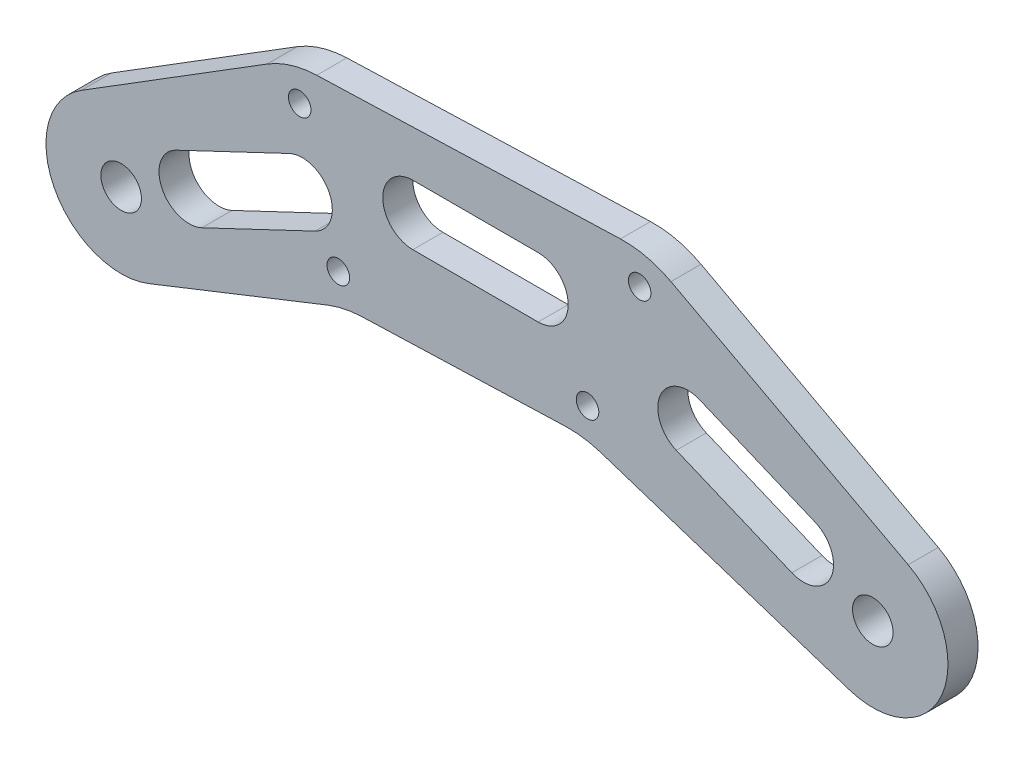
ISO-10303-21;
HEADER;
FILE_DESCRIPTION(('STEP AP214'),'2;1');
FILE_NAME('part.step','',(''),(''),'','','');
FILE_SCHEMA(('AUTOMOTIVE_DESIGN { 1 0 10303 214 1 1 1 1 }'));
ENDSEC;
DATA;
#1=APPLICATION_CONTEXT('core data for automotive mechanical design processes');
#2=APPLICATION_PROTOCOL_DEFINITION('international standard','automotive_design',2000,#1);
#3=PRODUCT_CONTEXT('',#1,'mechanical');
#4=PRODUCT('Part','Part','',(#3));
#5=PRODUCT_RELATED_PRODUCT_CATEGORY('part','',(#4));
#6=PRODUCT_DEFINITION_FORMATION('','',#4);
#7=PRODUCT_DEFINITION_CONTEXT('part definition',#1,'design');
#8=PRODUCT_DEFINITION('design','',#6,#7);
#9=PRODUCT_DEFINITION_SHAPE('','',#8);
#10=(LENGTH_UNIT() NAMED_UNIT(*) SI_UNIT(.MILLI.,.METRE.));
#11=(NAMED_UNIT(*) PLANE_ANGLE_UNIT() SI_UNIT($,.RADIAN.));
#12=(NAMED_UNIT(*) SI_UNIT($,.STERADIAN.) SOLID_ANGLE_UNIT());
#13=UNCERTAINTY_MEASURE_WITH_UNIT(LENGTH_MEASURE(1.E-05),#10,'distance_accuracy_value','');
#14=(GEOMETRIC_REPRESENTATION_CONTEXT(3) GLOBAL_UNCERTAINTY_ASSIGNED_CONTEXT((#13)) GLOBAL_UNIT_ASSIGNED_CONTEXT((#10,
#11,#12)) REPRESENTATION_CONTEXT('',''));
#15=CARTESIAN_POINT('',(0.,0.,0.));
#16=DIRECTION('',(0.,0.,1.));
#17=DIRECTION('',(1.,0.,0.));
#18=AXIS2_PLACEMENT_3D('',#15,#16,#17);
#19=CARTESIAN_POINT('',(-70.7115512272148,-24.2665577541173,6.));
#20=DIRECTION('',(0.,0.,-1.));
#21=DIRECTION('',(-1.,0.,0.));
#22=AXIS2_PLACEMENT_3D('',#19,#20,#21);
#23=PLANE('',#22);
#24=DIRECTION('',(1.,0.,0.));
#25=VECTOR('',#24,1.);
#26=CARTESIAN_POINT('',(-12.5,-6.,6.));
#27=LINE('',#26,#25);
#28=CARTESIAN_POINT('',(-12.5,-6.,6.));
#29=VERTEX_POINT('',#28);
#30=CARTESIAN_POINT('',(12.5,-6.,6.));
#31=VERTEX_POINT('',#30);
#32=EDGE_CURVE('E223',#29,#31,#27,.T.);
#33=ORIENTED_EDGE('',*,*,#32,.F.);
#34=CARTESIAN_POINT('',(-12.5,0.,6.));
#35=DIRECTION('',(0.,0.,1.));
#36=DIRECTION('',(1.,0.,0.));
#37=AXIS2_PLACEMENT_3D('',#34,#35,#36);
#38=CIRCLE('',#37,6.);
#39=CARTESIAN_POINT('',(-12.5,6.,6.));
#40=VERTEX_POINT('',#39);
#41=EDGE_CURVE('E50',#40,#29,#38,.T.);
#42=ORIENTED_EDGE('',*,*,#41,.F.);
#43=DIRECTION('',(-1.,0.,0.));
#44=VECTOR('',#43,1.);
#45=CARTESIAN_POINT('',(-12.5,6.,6.));
#46=LINE('',#45,#44);
#47=CARTESIAN_POINT('',(12.5,6.,6.));
#48=VERTEX_POINT('',#47);
#49=EDGE_CURVE('E214',#48,#40,#46,.T.);
#50=ORIENTED_EDGE('',*,*,#49,.F.);
#51=CARTESIAN_POINT('',(12.5,0.,6.));
#52=DIRECTION('',(0.,0.,1.));
#53=DIRECTION('',(1.,0.,0.));
#54=AXIS2_PLACEMENT_3D('',#51,#52,#53);
#55=CIRCLE('',#54,6.);
#56=EDGE_CURVE('E217',#31,#48,#55,.T.);
#57=ORIENTED_EDGE('',*,*,#56,.F.);
#58=EDGE_LOOP('',(#33,#42,#50,#57));
#59=FACE_BOUND('',#58,.T.);
#60=DIRECTION('',(-0.922762209023124,0.385369829642598,0.));
#61=VECTOR('',#60,1.);
#62=CARTESIAN_POINT('',(67.7592346142557,-12.9499951375712,6.));
#63=LINE('',#62,#61);
#64=CARTESIAN_POINT('',(67.7592346142558,-12.9499951375712,6.));
#65=VERTEX_POINT('',#64);
#66=CARTESIAN_POINT('',(44.6901793886776,-3.3157493965062,6.));
#67=VERTEX_POINT('',#66);
#68=EDGE_CURVE('E248',#65,#67,#63,.T.);
#69=ORIENTED_EDGE('',*,*,#68,.F.);
#70=CARTESIAN_POINT('',(65.4470156364002,-18.4865683917099,6.));
#71=DIRECTION('',(0.,0.,1.));
#72=DIRECTION('',(1.,0.,0.));
#73=AXIS2_PLACEMENT_3D('',#70,#71,#72);
#74=CIRCLE('',#73,5.99999999999999);
#75=CARTESIAN_POINT('',(63.1347966585446,-24.0231416458486,6.));
#76=VERTEX_POINT('',#75);
#77=EDGE_CURVE('E229',#76,#65,#74,.T.);
#78=ORIENTED_EDGE('',*,*,#77,.F.);
#79=DIRECTION('',(0.922762209023124,-0.385369829642598,0.));
#80=VECTOR('',#79,1.);
#81=CARTESIAN_POINT('',(63.1347966585446,-24.0231416458486,6.));
#82=LINE('',#81,#80);
#83=CARTESIAN_POINT('',(40.0657414329665,-14.3888959047837,6.));
#84=VERTEX_POINT('',#83);
#85=EDGE_CURVE('E237',#84,#76,#82,.T.);
#86=ORIENTED_EDGE('',*,*,#85,.F.);
#87=CARTESIAN_POINT('',(42.377960410822,-8.85232265064494,6.));
#88=DIRECTION('',(0.,0.,1.));
#89=DIRECTION('',(1.,0.,0.));
#90=AXIS2_PLACEMENT_3D('',#87,#88,#89);
#91=CIRCLE('',#90,6.);
#92=EDGE_CURVE('E251',#67,#84,#91,.T.);
#93=ORIENTED_EDGE('',*,*,#92,.F.);
#94=EDGE_LOOP('',(#69,#78,#86,#93));
#95=FACE_BOUND('',#94,.T.);
#96=DIRECTION('',(0.903508062462857,0.4285710921943,0.));
#97=VECTOR('',#96,1.);
#98=CARTESIAN_POINT('',(-54.5875037371061,-23.25903974598,6.));
#99=LINE('',#98,#97);
#100=CARTESIAN_POINT('',(-54.5875037371061,-23.25903974598,6.));
#101=VERTEX_POINT('',#100);
#102=CARTESIAN_POINT('',(-31.9998021755347,-12.5447624411225,6.));
#103=VERTEX_POINT('',#102);
#104=EDGE_CURVE('E280',#101,#103,#99,.T.);
#105=ORIENTED_EDGE('',*,*,#104,.F.);
#106=CARTESIAN_POINT('',(-57.1589302902719,-17.8379913712029,6.));
#107=DIRECTION('',(0.,0.,1.));
#108=DIRECTION('',(1.,0.,0.));
#109=AXIS2_PLACEMENT_3D('',#106,#107,#108);
#110=CIRCLE('',#109,6.);
#111=CARTESIAN_POINT('',(-59.7303568434377,-12.4169429964257,6.));
#112=VERTEX_POINT('',#111);
#113=EDGE_CURVE('E258',#112,#101,#110,.T.);
#114=ORIENTED_EDGE('',*,*,#113,.F.);
#115=DIRECTION('',(-0.903508062462857,-0.428571092194299,0.));
#116=VECTOR('',#115,1.);
#117=CARTESIAN_POINT('',(-59.7303568434377,-12.4169429964257,6.));
#118=LINE('',#117,#116);
#119=CARTESIAN_POINT('',(-37.1426552818663,-1.70266569156823,6.));
#120=VERTEX_POINT('',#119);
#121=EDGE_CURVE('E269',#120,#112,#118,.T.);
#122=ORIENTED_EDGE('',*,*,#121,.F.);
#123=CARTESIAN_POINT('',(-34.5712287287005,-7.12371406634537,6.));
#124=DIRECTION('',(0.,0.,1.));
#125=DIRECTION('',(1.,0.,0.));
#126=AXIS2_PLACEMENT_3D('',#123,#124,#125);
#127=CIRCLE('',#126,5.99999999999999);
#128=EDGE_CURVE('E283',#103,#120,#127,.T.);
#129=ORIENTED_EDGE('',*,*,#128,.F.);
#130=EDGE_LOOP('',(#105,#114,#122,#129));
#131=FACE_BOUND('',#130,.T.);
#132=CARTESIAN_POINT('',(-35.0784951033591,7.96194555421231,6.));
#133=DIRECTION('',(0.,0.,1.));
#134=DIRECTION('',(1.,0.,0.));
#135=AXIS2_PLACEMENT_3D('',#132,#133,#134);
#136=CIRCLE('',#135,2.24999999999999);
#137=CARTESIAN_POINT('',(-32.8284951033591,7.96194555421231,6.));
#138=VERTEX_POINT('',#137);
#139=EDGE_CURVE('E290',#138,#138,#136,.T.);
#140=ORIENTED_EDGE('',*,*,#139,.F.);
#141=EDGE_LOOP('',(#140));
#142=FACE_BOUND('',#141,.T.);
#143=CARTESIAN_POINT('',(-27.3698152849537,-17.2007993481256,6.));
#144=DIRECTION('',(0.,0.,1.));
#145=DIRECTION('',(1.,0.,0.));
#146=AXIS2_PLACEMENT_3D('',#143,#144,#145);
#147=CIRCLE('',#146,2.24999999999999);
#148=CARTESIAN_POINT('',(-25.1198152849537,-17.2007993481256,6.));
#149=VERTEX_POINT('',#148);
#150=EDGE_CURVE('E302',#149,#149,#147,.T.);
#151=ORIENTED_EDGE('',*,*,#150,.F.);
#152=EDGE_LOOP('',(#151));
#153=FACE_BOUND('',#152,.T.);
#154=CARTESIAN_POINT('',(32.7653353299699,10.2244112868449,6.));
#155=DIRECTION('',(0.,0.,1.));
#156=DIRECTION('',(1.,0.,0.));
#157=AXIS2_PLACEMENT_3D('',#154,#155,#156);
#158=CIRCLE('',#157,2.24999999999999);
#159=CARTESIAN_POINT('',(35.0153353299699,10.2244112868449,6.));
#160=VERTEX_POINT('',#159);
#161=EDGE_CURVE('E309',#160,#160,#158,.T.);
#162=ORIENTED_EDGE('',*,*,#161,.F.);
#163=EDGE_LOOP('',(#162));
#164=FACE_BOUND('',#163,.T.);
#165=CARTESIAN_POINT('',(22.3602976352602,-15.5546670955529,6.));
#166=DIRECTION('',(0.,0.,1.));
#167=DIRECTION('',(1.,0.,0.));
#168=AXIS2_PLACEMENT_3D('',#165,#166,#167);
#169=CIRCLE('',#168,2.24999999999999);
#170=CARTESIAN_POINT('',(24.6102976352601,-15.5546670955529,6.));
#171=VERTEX_POINT('',#170);
#172=EDGE_CURVE('E315',#171,#171,#169,.T.);
#173=ORIENTED_EDGE('',*,*,#172,.F.);
#174=EDGE_LOOP('',(#173));
#175=FACE_BOUND('',#174,.T.);
#176=CARTESIAN_POINT('',(-70.7115512272148,-24.2665577541173,6.));
#177=DIRECTION('',(0.,0.,1.));
#178=DIRECTION('',(-1.,0.,0.));
#179=AXIS2_PLACEMENT_3D('',#176,#177,#178);
#180=CIRCLE('',#179,15.0000000000001);
#181=CARTESIAN_POINT('',(-78.6403487299909,-11.533366081957,6.));
#182=VERTEX_POINT('',#181);
#183=CARTESIAN_POINT('',(-65.190609660412,-38.2135719226035,6.));
#184=VERTEX_POINT('',#183);
#185=EDGE_CURVE('E334',#182,#184,#180,.T.);
#186=ORIENTED_EDGE('',*,*,#185,.T.);
#187=DIRECTION('',(0.929800944565734,0.368062771120184,0.));
#188=VECTOR('',#187,1.);
#189=CARTESIAN_POINT('',(-65.190609660412,-38.2135719226035,6.));
#190=LINE('',#189,#188);
#191=CARTESIAN_POINT('',(-29.4350095105263,-24.0596765634428,6.));
#192=VERTEX_POINT('',#191);
#193=EDGE_CURVE('E337',#184,#192,#190,.T.);
#194=ORIENTED_EDGE('',*,*,#193,.T.);
#195=CARTESIAN_POINT('',(-22.0737540881226,-42.6556954547574,6.));
#196=DIRECTION('',(0.,0.,-1.));
#197=DIRECTION('',(-1.,0.,0.));
#198=AXIS2_PLACEMENT_3D('',#195,#196,#197);
#199=CIRCLE('',#198,20.);
#200=CARTESIAN_POINT('',(-22.7403463851714,-22.6668071737771,6.));
#201=VERTEX_POINT('',#200);
#202=EDGE_CURVE('E340',#192,#201,#199,.T.);
#203=ORIENTED_EDGE('',*,*,#202,.T.);
#204=DIRECTION('',(0.99944441404902,0.033329614852438,0.));
#205=VECTOR('',#204,1.);
#206=CARTESIAN_POINT('',(-22.7403463851714,-22.6668071737771,6.));
#207=LINE('',#206,#205);
#208=CARTESIAN_POINT('',(18.0347659484586,-21.3070329126563,6.));
#209=VERTEX_POINT('',#208);
#210=EDGE_CURVE('E342',#201,#209,#207,.T.);
#211=ORIENTED_EDGE('',*,*,#210,.T.);
#212=CARTESIAN_POINT('',(18.7013582455073,-41.2959211936367,6.));
#213=DIRECTION('',(0.,0.,-1.));
#214=DIRECTION('',(1.,0.,0.));
#215=AXIS2_PLACEMENT_3D('',#212,#213,#214);
#216=CIRCLE('',#215,20.);
#217=CARTESIAN_POINT('',(24.9115688176797,-22.2845223853091,6.));
#218=VERTEX_POINT('',#217);
#219=EDGE_CURVE('E344',#209,#218,#216,.T.);
#220=ORIENTED_EDGE('',*,*,#219,.T.);
#221=DIRECTION('',(0.950569940416378,-0.310510528608618,0.));
#222=VECTOR('',#221,1.);
#223=CARTESIAN_POINT('',(74.6307908426177,-38.5256649425946,6.));
#224=LINE('',#223,#222);
#225=CARTESIAN_POINT('',(74.6307908426177,-38.5256649425946,6.));
#226=VERTEX_POINT('',#225);
#227=EDGE_CURVE('E346',#218,#226,#224,.T.);
#228=ORIENTED_EDGE('',*,*,#227,.T.);
#229=CARTESIAN_POINT('',(79.288448771747,-24.2671158363489,6.));
#230=DIRECTION('',(0.,0.,1.));
#231=DIRECTION('',(1.,0.,0.));
#232=AXIS2_PLACEMENT_3D('',#229,#230,#231);
#233=CIRCLE('',#232,15.);
#234=CARTESIAN_POINT('',(86.3513174797062,-11.033979941402,6.));
#235=VERTEX_POINT('',#234);
#236=EDGE_CURVE('E348',#226,#235,#233,.T.);
#237=ORIENTED_EDGE('',*,*,#236,.T.);
#238=DIRECTION('',(-0.882209059663123,0.470857913863947,0.));
#239=VECTOR('',#238,1.);
#240=CARTESIAN_POINT('',(39.0117552236952,14.2323753322669,6.));
#241=LINE('',#240,#239);
#242=CARTESIAN_POINT('',(39.0117552236952,14.2323753322669,6.));
#243=VERTEX_POINT('',#242);
#244=EDGE_CURVE('E350',#235,#243,#241,.T.);
#245=ORIENTED_EDGE('',*,*,#244,.T.);
#246=CARTESIAN_POINT('',(29.5945969464162,-3.41180586099558,6.));
#247=DIRECTION('',(0.,0.,1.));
#248=DIRECTION('',(-1.,0.,0.));
#249=AXIS2_PLACEMENT_3D('',#246,#247,#248);
#250=CIRCLE('',#249,20.);
#251=CARTESIAN_POINT('',(28.9280046493675,16.5770824199848,6.));
#252=VERTEX_POINT('',#251);
#253=EDGE_CURVE('E352',#243,#252,#250,.T.);
#254=ORIENTED_EDGE('',*,*,#253,.T.);
#255=DIRECTION('',(-0.99944441404902,-0.033329614852438,0.));
#256=VECTOR('',#255,1.);
#257=CARTESIAN_POINT('',(-31.6729188153995,14.556154181865,6.));
#258=LINE('',#257,#256);
#259=CARTESIAN_POINT('',(-31.6729188153995,14.556154181865,6.));
#260=VERTEX_POINT('',#259);
#261=EDGE_CURVE('E354',#252,#260,#258,.T.);
#262=ORIENTED_EDGE('',*,*,#261,.T.);
#263=CARTESIAN_POINT('',(-31.0063265183507,-5.43273409911537,6.));
#264=DIRECTION('',(0.,0.,1.));
#265=DIRECTION('',(-1.,0.,0.));
#266=AXIS2_PLACEMENT_3D('',#263,#264,#265);
#267=CIRCLE('',#266,20.);
#268=CARTESIAN_POINT('',(-41.5780565220522,11.5448547970983,6.));
#269=VERTEX_POINT('',#268);
#270=EDGE_CURVE('E357',#260,#269,#267,.T.);
#271=ORIENTED_EDGE('',*,*,#270,.T.);
#272=DIRECTION('',(-0.848879444810685,-0.528586500185071,0.));
#273=VECTOR('',#272,1.);
#274=CARTESIAN_POINT('',(-78.6403487299909,-11.533366081957,6.));
#275=LINE('',#274,#273);
#276=EDGE_CURVE('E359',#269,#182,#275,.T.);
#277=ORIENTED_EDGE('',*,*,#276,.T.);
#278=EDGE_LOOP('',(#186,#194,#203,#211,#220,#228,#237,#245,#254,#262,#271,#277));
#279=FACE_BOUND('',#278,.T.);
#280=CARTESIAN_POINT('',(-70.7115512272148,-24.2665577541173,6.));
#281=DIRECTION('',(0.,0.,1.));
#282=DIRECTION('',(1.,0.,0.));
#283=AXIS2_PLACEMENT_3D('',#280,#281,#282);
#284=CIRCLE('',#283,4.05);
#285=CARTESIAN_POINT('',(-66.6615512272148,-24.2665577541173,6.));
#286=VERTEX_POINT('',#285);
#287=EDGE_CURVE('E328',#286,#286,#284,.T.);
#288=ORIENTED_EDGE('',*,*,#287,.F.);
#289=EDGE_LOOP('',(#288));
#290=FACE_BOUND('',#289,.T.);
#291=CARTESIAN_POINT('',(79.288448771747,-24.2671158363489,6.));
#292=DIRECTION('',(0.,0.,1.));
#293=DIRECTION('',(1.,0.,0.));
#294=AXIS2_PLACEMENT_3D('',#291,#292,#293);
#295=CIRCLE('',#294,4.05);
#296=CARTESIAN_POINT('',(83.338448771747,-24.2671158363489,6.));
#297=VERTEX_POINT('',#296);
#298=EDGE_CURVE('E322',#297,#297,#295,.T.);
#299=ORIENTED_EDGE('',*,*,#298,.F.);
#300=EDGE_LOOP('',(#299));
#301=FACE_BOUND('',#300,.T.);
#302=ADVANCED_FACE('F35',(#59,#95,#131,#142,#153,#164,#175,#279,#290,#301),#23,.F.);
#303=CARTESIAN_POINT('',(-70.7115512272148,-24.2665577541173,0.));
#304=DIRECTION('',(0.,0.,-1.));
#305=DIRECTION('',(-1.,0.,0.));
#306=AXIS2_PLACEMENT_3D('',#303,#304,#305);
#307=PLANE('',#306);
#308=CARTESIAN_POINT('',(-12.5,0.,0.));
#309=DIRECTION('',(0.,0.,1.));
#310=DIRECTION('',(1.,0.,0.));
#311=AXIS2_PLACEMENT_3D('',#308,#309,#310);
#312=CIRCLE('',#311,6.);
#313=CARTESIAN_POINT('',(-12.5,6.,0.));
#314=VERTEX_POINT('',#313);
#315=CARTESIAN_POINT('',(-12.5,-6.,0.));
#316=VERTEX_POINT('',#315);
#317=EDGE_CURVE('E198',#314,#316,#312,.T.);
#318=ORIENTED_EDGE('',*,*,#317,.T.);
#319=DIRECTION('',(1.,0.,0.));
#320=VECTOR('',#319,1.);
#321=CARTESIAN_POINT('',(-12.5,-6.,0.));
#322=LINE('',#321,#320);
#323=CARTESIAN_POINT('',(12.5,-5.99999999999999,0.));
#324=VERTEX_POINT('',#323);
#325=EDGE_CURVE('E207',#316,#324,#322,.T.);
#326=ORIENTED_EDGE('',*,*,#325,.T.);
#327=CARTESIAN_POINT('',(12.5,0.,0.));
#328=DIRECTION('',(0.,0.,1.));
#329=DIRECTION('',(1.,0.,0.));
#330=AXIS2_PLACEMENT_3D('',#327,#328,#329);
#331=CIRCLE('',#330,6.);
#332=CARTESIAN_POINT('',(12.5,6.,0.));
#333=VERTEX_POINT('',#332);
#334=EDGE_CURVE('E58',#324,#333,#331,.T.);
#335=ORIENTED_EDGE('',*,*,#334,.T.);
#336=DIRECTION('',(-1.,0.,0.));
#337=VECTOR('',#336,1.);
#338=CARTESIAN_POINT('',(-12.5,6.,0.));
#339=LINE('',#338,#337);
#340=EDGE_CURVE('E204',#333,#314,#339,.T.);
#341=ORIENTED_EDGE('',*,*,#340,.T.);
#342=EDGE_LOOP('',(#318,#326,#335,#341));
#343=FACE_BOUND('',#342,.T.);
#344=CARTESIAN_POINT('',(65.4470156364002,-18.4865683917099,0.));
#345=DIRECTION('',(0.,0.,1.));
#346=DIRECTION('',(1.,0.,0.));
#347=AXIS2_PLACEMENT_3D('',#344,#345,#346);
#348=CIRCLE('',#347,5.99999999999999);
#349=CARTESIAN_POINT('',(63.1347966585446,-24.0231416458486,0.));
#350=VERTEX_POINT('',#349);
#351=CARTESIAN_POINT('',(67.7592346142557,-12.9499951375712,0.));
#352=VERTEX_POINT('',#351);
#353=EDGE_CURVE('E233',#350,#352,#348,.T.);
#354=ORIENTED_EDGE('',*,*,#353,.T.);
#355=DIRECTION('',(-0.922762209023124,0.385369829642598,0.));
#356=VECTOR('',#355,1.);
#357=CARTESIAN_POINT('',(67.7592346142557,-12.9499951375712,0.));
#358=LINE('',#357,#356);
#359=CARTESIAN_POINT('',(44.6901793886776,-3.31574939650619,0.));
#360=VERTEX_POINT('',#359);
#361=EDGE_CURVE('E236',#352,#360,#358,.T.);
#362=ORIENTED_EDGE('',*,*,#361,.T.);
#363=CARTESIAN_POINT('',(42.377960410822,-8.85232265064494,0.));
#364=DIRECTION('',(0.,0.,1.));
#365=DIRECTION('',(1.,0.,0.));
#366=AXIS2_PLACEMENT_3D('',#363,#364,#365);
#367=CIRCLE('',#366,6.);
#368=CARTESIAN_POINT('',(40.0657414329665,-14.3888959047837,0.));
#369=VERTEX_POINT('',#368);
#370=EDGE_CURVE('E240',#360,#369,#367,.T.);
#371=ORIENTED_EDGE('',*,*,#370,.T.);
#372=DIRECTION('',(0.922762209023124,-0.385369829642598,0.));
#373=VECTOR('',#372,1.);
#374=CARTESIAN_POINT('',(63.1347966585446,-24.0231416458486,0.));
#375=LINE('',#374,#373);
#376=EDGE_CURVE('E243',#369,#350,#375,.T.);
#377=ORIENTED_EDGE('',*,*,#376,.T.);
#378=EDGE_LOOP('',(#354,#362,#371,#377));
#379=FACE_BOUND('',#378,.T.);
#380=CARTESIAN_POINT('',(-57.1589302902719,-17.8379913712029,0.));
#381=DIRECTION('',(0.,0.,1.));
#382=DIRECTION('',(1.,0.,0.));
#383=AXIS2_PLACEMENT_3D('',#380,#381,#382);
#384=CIRCLE('',#383,6.);
#385=CARTESIAN_POINT('',(-59.7303568434377,-12.4169429964257,0.));
#386=VERTEX_POINT('',#385);
#387=CARTESIAN_POINT('',(-54.5875037371061,-23.25903974598,0.));
#388=VERTEX_POINT('',#387);
#389=EDGE_CURVE('E265',#386,#388,#384,.T.);
#390=ORIENTED_EDGE('',*,*,#389,.T.);
#391=DIRECTION('',(0.903508062462857,0.4285710921943,0.));
#392=VECTOR('',#391,1.);
#393=CARTESIAN_POINT('',(-54.5875037371061,-23.25903974598,0.));
#394=LINE('',#393,#392);
#395=CARTESIAN_POINT('',(-31.9998021755347,-12.5447624411225,0.));
#396=VERTEX_POINT('',#395);
#397=EDGE_CURVE('E268',#388,#396,#394,.T.);
#398=ORIENTED_EDGE('',*,*,#397,.T.);
#399=CARTESIAN_POINT('',(-34.5712287287005,-7.12371406634537,0.));
#400=DIRECTION('',(0.,0.,1.));
#401=DIRECTION('',(1.,0.,0.));
#402=AXIS2_PLACEMENT_3D('',#399,#400,#401);
#403=CIRCLE('',#402,5.99999999999999);
#404=CARTESIAN_POINT('',(-37.1426552818663,-1.70266569156823,0.));
#405=VERTEX_POINT('',#404);
#406=EDGE_CURVE('E272',#396,#405,#403,.T.);
#407=ORIENTED_EDGE('',*,*,#406,.T.);
#408=DIRECTION('',(-0.903508062462857,-0.428571092194299,0.));
#409=VECTOR('',#408,1.);
#410=CARTESIAN_POINT('',(-59.7303568434377,-12.4169429964257,0.));
#411=LINE('',#410,#409);
#412=EDGE_CURVE('E275',#405,#386,#411,.T.);
#413=ORIENTED_EDGE('',*,*,#412,.T.);
#414=EDGE_LOOP('',(#390,#398,#407,#413));
#415=FACE_BOUND('',#414,.T.);
#416=CARTESIAN_POINT('',(-35.0784951033591,7.96194555421231,0.));
#417=DIRECTION('',(0.,0.,-1.));
#418=DIRECTION('',(-1.,0.,0.));
#419=AXIS2_PLACEMENT_3D('',#416,#417,#418);
#420=CIRCLE('',#419,2.24999999999998);
#421=CARTESIAN_POINT('',(-37.3284951033591,7.96194555421231,0.));
#422=VERTEX_POINT('',#421);
#423=EDGE_CURVE('E299',#422,#422,#420,.T.);
#424=ORIENTED_EDGE('',*,*,#423,.F.);
#425=EDGE_LOOP('',(#424));
#426=FACE_BOUND('',#425,.T.);
#427=CARTESIAN_POINT('',(-27.3698152849537,-17.2007993481256,0.));
#428=DIRECTION('',(0.,0.,-1.));
#429=DIRECTION('',(-1.,0.,0.));
#430=AXIS2_PLACEMENT_3D('',#427,#428,#429);
#431=CIRCLE('',#430,2.24999999999998);
#432=CARTESIAN_POINT('',(-29.6198152849537,-17.2007993481256,0.));
#433=VERTEX_POINT('',#432);
#434=EDGE_CURVE('E305',#433,#433,#431,.T.);
#435=ORIENTED_EDGE('',*,*,#434,.F.);
#436=EDGE_LOOP('',(#435));
#437=FACE_BOUND('',#436,.T.);
#438=CARTESIAN_POINT('',(32.7653353299699,10.2244112868449,0.));
#439=DIRECTION('',(0.,0.,-1.));
#440=DIRECTION('',(-1.,0.,0.));
#441=AXIS2_PLACEMENT_3D('',#438,#439,#440);
#442=CIRCLE('',#441,2.24999999999998);
#443=CARTESIAN_POINT('',(30.5153353299699,10.2244112868449,0.));
#444=VERTEX_POINT('',#443);
#445=EDGE_CURVE('E312',#444,#444,#442,.T.);
#446=ORIENTED_EDGE('',*,*,#445,.F.);
#447=EDGE_LOOP('',(#446));
#448=FACE_BOUND('',#447,.T.);
#449=CARTESIAN_POINT('',(22.3602976352602,-15.5546670955529,0.));
#450=DIRECTION('',(0.,0.,-1.));
#451=DIRECTION('',(-1.,0.,0.));
#452=AXIS2_PLACEMENT_3D('',#449,#450,#451);
#453=CIRCLE('',#452,2.24999999999998);
#454=CARTESIAN_POINT('',(20.1102976352602,-15.5546670955529,0.));
#455=VERTEX_POINT('',#454);
#456=EDGE_CURVE('E318',#455,#455,#453,.T.);
#457=ORIENTED_EDGE('',*,*,#456,.F.);
#458=EDGE_LOOP('',(#457));
#459=FACE_BOUND('',#458,.T.);
#460=CARTESIAN_POINT('',(-70.7115512272148,-24.2665577541173,0.));
#461=DIRECTION('',(0.,0.,1.));
#462=DIRECTION('',(1.,0.,0.));
#463=AXIS2_PLACEMENT_3D('',#460,#461,#462);
#464=CIRCLE('',#463,4.05);
#465=CARTESIAN_POINT('',(-66.6615512272148,-24.2665577541173,0.));
#466=VERTEX_POINT('',#465);
#467=EDGE_CURVE('E325',#466,#466,#464,.T.);
#468=ORIENTED_EDGE('',*,*,#467,.T.);
#469=EDGE_LOOP('',(#468));
#470=FACE_BOUND('',#469,.T.);
#471=CARTESIAN_POINT('',(-70.7115512272148,-24.2665577541173,0.));
#472=DIRECTION('',(0.,0.,1.));
#473=DIRECTION('',(-1.,0.,0.));
#474=AXIS2_PLACEMENT_3D('',#471,#472,#473);
#475=CIRCLE('',#474,15.0000000000001);
#476=CARTESIAN_POINT('',(-78.6403487299909,-11.533366081957,0.));
#477=VERTEX_POINT('',#476);
#478=CARTESIAN_POINT('',(-65.190609660412,-38.2135719226035,0.));
#479=VERTEX_POINT('',#478);
#480=EDGE_CURVE('E331',#477,#479,#475,.T.);
#481=ORIENTED_EDGE('',*,*,#480,.F.);
#482=DIRECTION('',(-0.848879444810685,-0.528586500185071,0.));
#483=VECTOR('',#482,1.);
#484=CARTESIAN_POINT('',(-78.6403487299909,-11.533366081957,0.));
#485=LINE('',#484,#483);
#486=CARTESIAN_POINT('',(-41.5780565220522,11.5448547970983,0.));
#487=VERTEX_POINT('',#486);
#488=EDGE_CURVE('E338',#487,#477,#485,.T.);
#489=ORIENTED_EDGE('',*,*,#488,.F.);
#490=CARTESIAN_POINT('',(-31.0063265183507,-5.43273409911537,0.));
#491=DIRECTION('',(0.,0.,1.));
#492=DIRECTION('',(-1.,0.,0.));
#493=AXIS2_PLACEMENT_3D('',#490,#491,#492);
#494=CIRCLE('',#493,20.);
#495=CARTESIAN_POINT('',(-31.6729188153995,14.556154181865,0.));
#496=VERTEX_POINT('',#495);
#497=EDGE_CURVE('E382',#496,#487,#494,.T.);
#498=ORIENTED_EDGE('',*,*,#497,.F.);
#499=DIRECTION('',(-0.99944441404902,-0.033329614852438,0.));
#500=VECTOR('',#499,1.);
#501=CARTESIAN_POINT('',(-31.6729188153995,14.556154181865,0.));
#502=LINE('',#501,#500);
#503=CARTESIAN_POINT('',(28.9280046493675,16.5770824199848,0.));
#504=VERTEX_POINT('',#503);
#505=EDGE_CURVE('E380',#504,#496,#502,.T.);
#506=ORIENTED_EDGE('',*,*,#505,.F.);
#507=CARTESIAN_POINT('',(29.5945969464162,-3.41180586099558,0.));
#508=DIRECTION('',(0.,0.,1.));
#509=DIRECTION('',(-1.,0.,0.));
#510=AXIS2_PLACEMENT_3D('',#507,#508,#509);
#511=CIRCLE('',#510,20.);
#512=CARTESIAN_POINT('',(39.0117552236952,14.2323753322669,0.));
#513=VERTEX_POINT('',#512);
#514=EDGE_CURVE('E378',#513,#504,#511,.T.);
#515=ORIENTED_EDGE('',*,*,#514,.F.);
#516=DIRECTION('',(-0.882209059663123,0.470857913863947,0.));
#517=VECTOR('',#516,1.);
#518=CARTESIAN_POINT('',(39.0117552236952,14.2323753322669,0.));
#519=LINE('',#518,#517);
#520=CARTESIAN_POINT('',(86.3513174797062,-11.033979941402,0.));
#521=VERTEX_POINT('',#520);
#522=EDGE_CURVE('E376',#521,#513,#519,.T.);
#523=ORIENTED_EDGE('',*,*,#522,.F.);
#524=CARTESIAN_POINT('',(79.288448771747,-24.2671158363489,0.));
#525=DIRECTION('',(0.,0.,1.));
#526=DIRECTION('',(1.,0.,0.));
#527=AXIS2_PLACEMENT_3D('',#524,#525,#526);
#528=CIRCLE('',#527,15.);
#529=CARTESIAN_POINT('',(74.6307908426177,-38.5256649425946,0.));
#530=VERTEX_POINT('',#529);
#531=EDGE_CURVE('E374',#530,#521,#528,.T.);
#532=ORIENTED_EDGE('',*,*,#531,.F.);
#533=DIRECTION('',(0.950569940416378,-0.310510528608618,0.));
#534=VECTOR('',#533,1.);
#535=CARTESIAN_POINT('',(74.6307908426177,-38.5256649425946,0.));
#536=LINE('',#535,#534);
#537=CARTESIAN_POINT('',(24.9115688176797,-22.2845223853091,0.));
#538=VERTEX_POINT('',#537);
#539=EDGE_CURVE('E372',#538,#530,#536,.T.);
#540=ORIENTED_EDGE('',*,*,#539,.F.);
#541=CARTESIAN_POINT('',(18.7013582455073,-41.2959211936367,0.));
#542=DIRECTION('',(0.,0.,-1.));
#543=DIRECTION('',(1.,0.,0.));
#544=AXIS2_PLACEMENT_3D('',#541,#542,#543);
#545=CIRCLE('',#544,20.);
#546=CARTESIAN_POINT('',(18.0347659484586,-21.3070329126563,0.));
#547=VERTEX_POINT('',#546);
#548=EDGE_CURVE('E370',#547,#538,#545,.T.);
#549=ORIENTED_EDGE('',*,*,#548,.F.);
#550=DIRECTION('',(0.99944441404902,0.033329614852438,0.));
#551=VECTOR('',#550,1.);
#552=CARTESIAN_POINT('',(-22.7403463851714,-22.6668071737771,0.));
#553=LINE('',#552,#551);
#554=CARTESIAN_POINT('',(-22.7403463851714,-22.6668071737771,0.));
#555=VERTEX_POINT('',#554);
#556=EDGE_CURVE('E368',#555,#547,#553,.T.);
#557=ORIENTED_EDGE('',*,*,#556,.F.);
#558=CARTESIAN_POINT('',(-22.0737540881226,-42.6556954547574,0.));
#559=DIRECTION('',(0.,0.,-1.));
#560=DIRECTION('',(-1.,0.,0.));
#561=AXIS2_PLACEMENT_3D('',#558,#559,#560);
#562=CIRCLE('',#561,20.);
#563=CARTESIAN_POINT('',(-29.4350095105263,-24.0596765634428,0.));
#564=VERTEX_POINT('',#563);
#565=EDGE_CURVE('E366',#564,#555,#562,.T.);
#566=ORIENTED_EDGE('',*,*,#565,.F.);
#567=DIRECTION('',(0.929800944565734,0.368062771120184,0.));
#568=VECTOR('',#567,1.);
#569=CARTESIAN_POINT('',(-65.190609660412,-38.2135719226035,0.));
#570=LINE('',#569,#568);
#571=EDGE_CURVE('E364',#479,#564,#570,.T.);
#572=ORIENTED_EDGE('',*,*,#571,.F.);
#573=EDGE_LOOP('',(#481,#489,#498,#506,#515,#523,#532,#540,#549,#557,#566,#572));
#574=FACE_BOUND('',#573,.T.);
#575=CARTESIAN_POINT('',(79.288448771747,-24.2671158363489,0.));
#576=DIRECTION('',(0.,0.,1.));
#577=DIRECTION('',(1.,0.,0.));
#578=AXIS2_PLACEMENT_3D('',#575,#576,#577);
#579=CIRCLE('',#578,4.05);
#580=CARTESIAN_POINT('',(83.338448771747,-24.2671158363489,0.));
#581=VERTEX_POINT('',#580);
#582=EDGE_CURVE('E321',#581,#581,#579,.T.);
#583=ORIENTED_EDGE('',*,*,#582,.T.);
#584=EDGE_LOOP('',(#583));
#585=FACE_BOUND('',#584,.T.);
#586=ADVANCED_FACE('F211',(#343,#379,#415,#426,#437,#448,#459,#470,#574,#585),#307,.T.);
#587=CARTESIAN_POINT('',(-70.7115512272148,-24.2665577541173,6.));
#588=DIRECTION('',(0.,0.,-1.));
#589=DIRECTION('',(-1.,0.,0.));
#590=AXIS2_PLACEMENT_3D('',#587,#588,#589);
#591=CYLINDRICAL_SURFACE('',#590,15.0000000000001);
#592=ORIENTED_EDGE('',*,*,#480,.T.);
#593=DIRECTION('',(0.,0.,-1.));
#594=VECTOR('',#593,1.);
#595=CARTESIAN_POINT('',(-65.190609660412,-38.2135719226035,6.));
#596=LINE('',#595,#594);
#597=EDGE_CURVE('E11',#184,#479,#596,.T.);
#598=ORIENTED_EDGE('',*,*,#597,.F.);
#599=ORIENTED_EDGE('',*,*,#185,.F.);
#600=DIRECTION('',(0.,0.,-1.));
#601=VECTOR('',#600,1.);
#602=CARTESIAN_POINT('',(-78.6403487299909,-11.533366081957,6.));
#603=LINE('',#602,#601);
#604=EDGE_CURVE('E361',#182,#477,#603,.T.);
#605=ORIENTED_EDGE('',*,*,#604,.T.);
#606=EDGE_LOOP('',(#592,#598,#599,#605));
#607=FACE_BOUND('',#606,.T.);
#608=ADVANCED_FACE('F37',(#607),#591,.T.);
#609=CARTESIAN_POINT('',(-65.190609660412,-38.2135719226035,6.));
#610=DIRECTION('',(-0.368062771120184,0.929800944565734,0.));
#611=DIRECTION('',(-0.929800944565734,-0.368062771120184,0.));
#612=AXIS2_PLACEMENT_3D('',#609,#610,#611);
#613=PLANE('',#612);
#614=ORIENTED_EDGE('',*,*,#571,.T.);
#615=DIRECTION('',(0.,0.,-1.));
#616=VECTOR('',#615,1.);
#617=CARTESIAN_POINT('',(-29.4350095105263,-24.0596765634428,6.));
#618=LINE('',#617,#616);
#619=EDGE_CURVE('E43',#192,#564,#618,.T.);
#620=ORIENTED_EDGE('',*,*,#619,.F.);
#621=ORIENTED_EDGE('',*,*,#193,.F.);
#622=ORIENTED_EDGE('',*,*,#597,.T.);
#623=EDGE_LOOP('',(#614,#620,#621,#622));
#624=FACE_BOUND('',#623,.T.);
#625=ADVANCED_FACE('F441',(#624),#613,.F.);
#626=CARTESIAN_POINT('',(-22.0737540881226,-42.6556954547574,6.));
#627=DIRECTION('',(0.,0.,-1.));
#628=DIRECTION('',(-1.,0.,0.));
#629=AXIS2_PLACEMENT_3D('',#626,#627,#628);
#630=CYLINDRICAL_SURFACE('',#629,20.);
#631=ORIENTED_EDGE('',*,*,#565,.T.);
#632=DIRECTION('',(0.,0.,-1.));
#633=VECTOR('',#632,1.);
#634=CARTESIAN_POINT('',(-22.7403463851714,-22.6668071737771,6.));
#635=LINE('',#634,#633);
#636=EDGE_CURVE('E411',#201,#555,#635,.T.);
#637=ORIENTED_EDGE('',*,*,#636,.F.);
#638=ORIENTED_EDGE('',*,*,#202,.F.);
#639=ORIENTED_EDGE('',*,*,#619,.T.);
#640=EDGE_LOOP('',(#631,#637,#638,#639));
#641=FACE_BOUND('',#640,.T.);
#642=ADVANCED_FACE('F418',(#641),#630,.F.);
#643=CARTESIAN_POINT('',(-22.7403463851714,-22.6668071737771,6.));
#644=DIRECTION('',(-0.033329614852438,0.99944441404902,0.));
#645=DIRECTION('',(-0.99944441404902,-0.033329614852438,0.));
#646=AXIS2_PLACEMENT_3D('',#643,#644,#645);
#647=PLANE('',#646);
#648=ORIENTED_EDGE('',*,*,#556,.T.);
#649=DIRECTION('',(0.,0.,-1.));
#650=VECTOR('',#649,1.);
#651=CARTESIAN_POINT('',(18.0347659484586,-21.3070329126563,6.));
#652=LINE('',#651,#650);
#653=EDGE_CURVE('E408',#209,#547,#652,.T.);
#654=ORIENTED_EDGE('',*,*,#653,.F.);
#655=ORIENTED_EDGE('',*,*,#210,.F.);
#656=ORIENTED_EDGE('',*,*,#636,.T.);
#657=EDGE_LOOP('',(#648,#654,#655,#656));
#658=FACE_BOUND('',#657,.T.);
#659=ADVANCED_FACE('F429',(#658),#647,.F.);
#660=CARTESIAN_POINT('',(18.7013582455073,-41.2959211936367,6.));
#661=DIRECTION('',(0.,0.,-1.));
#662=DIRECTION('',(-1.,0.,0.));
#663=AXIS2_PLACEMENT_3D('',#660,#661,#662);
#664=CYLINDRICAL_SURFACE('',#663,20.);
#665=ORIENTED_EDGE('',*,*,#548,.T.);
#666=DIRECTION('',(0.,0.,-1.));
#667=VECTOR('',#666,1.);
#668=CARTESIAN_POINT('',(24.9115688176797,-22.2845223853091,6.));
#669=LINE('',#668,#667);
#670=EDGE_CURVE('E405',#218,#538,#669,.T.);
#671=ORIENTED_EDGE('',*,*,#670,.F.);
#672=ORIENTED_EDGE('',*,*,#219,.F.);
#673=ORIENTED_EDGE('',*,*,#653,.T.);
#674=EDGE_LOOP('',(#665,#671,#672,#673));
#675=FACE_BOUND('',#674,.T.);
#676=ADVANCED_FACE('F433',(#675),#664,.F.);
#677=CARTESIAN_POINT('',(74.6307908426177,-38.5256649425946,6.));
#678=DIRECTION('',(0.310510528608618,0.950569940416378,0.));
#679=DIRECTION('',(-0.950569940416378,0.310510528608618,0.));
#680=AXIS2_PLACEMENT_3D('',#677,#678,#679);
#681=PLANE('',#680);
#682=ORIENTED_EDGE('',*,*,#539,.T.);
#683=DIRECTION('',(0.,0.,-1.));
#684=VECTOR('',#683,1.);
#685=CARTESIAN_POINT('',(74.6307908426177,-38.5256649425946,6.));
#686=LINE('',#685,#684);
#687=EDGE_CURVE('E402',#226,#530,#686,.T.);
#688=ORIENTED_EDGE('',*,*,#687,.F.);
#689=ORIENTED_EDGE('',*,*,#227,.F.);
#690=ORIENTED_EDGE('',*,*,#670,.T.);
#691=EDGE_LOOP('',(#682,#688,#689,#690));
#692=FACE_BOUND('',#691,.T.);
#693=ADVANCED_FACE('F474',(#692),#681,.F.);
#694=CARTESIAN_POINT('',(79.288448771747,-24.2671158363489,6.));
#695=DIRECTION('',(0.,0.,-1.));
#696=DIRECTION('',(-1.,0.,0.));
#697=AXIS2_PLACEMENT_3D('',#694,#695,#696);
#698=CYLINDRICAL_SURFACE('',#697,15.);
#699=ORIENTED_EDGE('',*,*,#531,.T.);
#700=DIRECTION('',(0.,0.,-1.));
#701=VECTOR('',#700,1.);
#702=CARTESIAN_POINT('',(86.3513174797062,-11.033979941402,6.));
#703=LINE('',#702,#701);
#704=EDGE_CURVE('E399',#235,#521,#703,.T.);
#705=ORIENTED_EDGE('',*,*,#704,.F.);
#706=ORIENTED_EDGE('',*,*,#236,.F.);
#707=ORIENTED_EDGE('',*,*,#687,.T.);
#708=EDGE_LOOP('',(#699,#705,#706,#707));
#709=FACE_BOUND('',#708,.T.);
#710=ADVANCED_FACE('F472',(#709),#698,.T.);
#711=CARTESIAN_POINT('',(39.0117552236952,14.2323753322669,6.));
#712=DIRECTION('',(-0.470857913863947,-0.882209059663123,0.));
#713=DIRECTION('',(0.882209059663123,-0.470857913863947,0.));
#714=AXIS2_PLACEMENT_3D('',#711,#712,#713);
#715=PLANE('',#714);
#716=ORIENTED_EDGE('',*,*,#522,.T.);
#717=DIRECTION('',(0.,0.,-1.));
#718=VECTOR('',#717,1.);
#719=CARTESIAN_POINT('',(39.0117552236952,14.2323753322669,6.));
#720=LINE('',#719,#718);
#721=EDGE_CURVE('E396',#243,#513,#720,.T.);
#722=ORIENTED_EDGE('',*,*,#721,.F.);
#723=ORIENTED_EDGE('',*,*,#244,.F.);
#724=ORIENTED_EDGE('',*,*,#704,.T.);
#725=EDGE_LOOP('',(#716,#722,#723,#724));
#726=FACE_BOUND('',#725,.T.);
#727=ADVANCED_FACE('F468',(#726),#715,.F.);
#728=CARTESIAN_POINT('',(29.5945969464162,-3.41180586099558,6.));
#729=DIRECTION('',(0.,0.,-1.));
#730=DIRECTION('',(-1.,0.,0.));
#731=AXIS2_PLACEMENT_3D('',#728,#729,#730);
#732=CYLINDRICAL_SURFACE('',#731,20.);
#733=ORIENTED_EDGE('',*,*,#514,.T.);
#734=DIRECTION('',(0.,0.,-1.));
#735=VECTOR('',#734,1.);
#736=CARTESIAN_POINT('',(28.9280046493675,16.5770824199848,6.));
#737=LINE('',#736,#735);
#738=EDGE_CURVE('E393',#252,#504,#737,.T.);
#739=ORIENTED_EDGE('',*,*,#738,.F.);
#740=ORIENTED_EDGE('',*,*,#253,.F.);
#741=ORIENTED_EDGE('',*,*,#721,.T.);
#742=EDGE_LOOP('',(#733,#739,#740,#741));
#743=FACE_BOUND('',#742,.T.);
#744=ADVANCED_FACE('F463',(#743),#732,.T.);
#745=CARTESIAN_POINT('',(-31.6729188153995,14.556154181865,6.));
#746=DIRECTION('',(0.033329614852438,-0.99944441404902,0.));
#747=DIRECTION('',(0.99944441404902,0.033329614852438,0.));
#748=AXIS2_PLACEMENT_3D('',#745,#746,#747);
#749=PLANE('',#748);
#750=ORIENTED_EDGE('',*,*,#505,.T.);
#751=DIRECTION('',(0.,0.,-1.));
#752=VECTOR('',#751,1.);
#753=CARTESIAN_POINT('',(-31.6729188153995,14.556154181865,6.));
#754=LINE('',#753,#752);
#755=EDGE_CURVE('E390',#260,#496,#754,.T.);
#756=ORIENTED_EDGE('',*,*,#755,.F.);
#757=ORIENTED_EDGE('',*,*,#261,.F.);
#758=ORIENTED_EDGE('',*,*,#738,.T.);
#759=EDGE_LOOP('',(#750,#756,#757,#758));
#760=FACE_BOUND('',#759,.T.);
#761=ADVANCED_FACE('F457',(#760),#749,.F.);
#762=CARTESIAN_POINT('',(-31.0063265183507,-5.43273409911537,6.));
#763=DIRECTION('',(0.,0.,-1.));
#764=DIRECTION('',(-1.,0.,0.));
#765=AXIS2_PLACEMENT_3D('',#762,#763,#764);
#766=CYLINDRICAL_SURFACE('',#765,20.);
#767=ORIENTED_EDGE('',*,*,#497,.T.);
#768=DIRECTION('',(0.,0.,-1.));
#769=VECTOR('',#768,1.);
#770=CARTESIAN_POINT('',(-41.5780565220522,11.5448547970983,6.));
#771=LINE('',#770,#769);
#772=EDGE_CURVE('E387',#269,#487,#771,.T.);
#773=ORIENTED_EDGE('',*,*,#772,.F.);
#774=ORIENTED_EDGE('',*,*,#270,.F.);
#775=ORIENTED_EDGE('',*,*,#755,.T.);
#776=EDGE_LOOP('',(#767,#773,#774,#775));
#777=FACE_BOUND('',#776,.T.);
#778=ADVANCED_FACE('F453',(#777),#766,.T.);
#779=CARTESIAN_POINT('',(-78.6403487299909,-11.533366081957,6.));
#780=DIRECTION('',(0.528586500185071,-0.848879444810685,0.));
#781=DIRECTION('',(0.848879444810685,0.528586500185071,0.));
#782=AXIS2_PLACEMENT_3D('',#779,#780,#781);
#783=PLANE('',#782);
#784=ORIENTED_EDGE('',*,*,#488,.T.);
#785=ORIENTED_EDGE('',*,*,#604,.F.);
#786=ORIENTED_EDGE('',*,*,#276,.F.);
#787=ORIENTED_EDGE('',*,*,#772,.T.);
#788=EDGE_LOOP('',(#784,#785,#786,#787));
#789=FACE_BOUND('',#788,.T.);
#790=ADVANCED_FACE('F448',(#789),#783,.F.);
#791=CARTESIAN_POINT('',(-70.7115512272148,-24.2665577541173,6.));
#792=DIRECTION('',(0.,0.,-1.));
#793=DIRECTION('',(-1.,0.,0.));
#794=AXIS2_PLACEMENT_3D('',#791,#792,#793);
#795=CYLINDRICAL_SURFACE('',#794,4.05);
#796=ORIENTED_EDGE('',*,*,#287,.T.);
#797=EDGE_LOOP('',(#796));
#798=FACE_BOUND('',#797,.T.);
#799=ORIENTED_EDGE('',*,*,#467,.F.);
#800=EDGE_LOOP('',(#799));
#801=FACE_BOUND('',#800,.T.);
#802=ADVANCED_FACE('F492',(#798,#801),#795,.F.);
#803=CARTESIAN_POINT('',(79.288448771747,-24.2671158363489,6.));
#804=DIRECTION('',(0.,0.,-1.));
#805=DIRECTION('',(-1.,0.,0.));
#806=AXIS2_PLACEMENT_3D('',#803,#804,#805);
#807=CYLINDRICAL_SURFACE('',#806,4.05);
#808=ORIENTED_EDGE('',*,*,#298,.T.);
#809=EDGE_LOOP('',(#808));
#810=FACE_BOUND('',#809,.T.);
#811=ORIENTED_EDGE('',*,*,#582,.F.);
#812=EDGE_LOOP('',(#811));
#813=FACE_BOUND('',#812,.T.);
#814=ADVANCED_FACE('F530',(#810,#813),#807,.F.);
#815=CARTESIAN_POINT('',(22.3602976352602,-15.5546670955529,6.));
#816=DIRECTION('',(0.,0.,1.));
#817=DIRECTION('',(1.,0.,0.));
#818=AXIS2_PLACEMENT_3D('',#815,#816,#817);
#819=CYLINDRICAL_SURFACE('',#818,2.24999999999998);
#820=ORIENTED_EDGE('',*,*,#456,.T.);
#821=EDGE_LOOP('',(#820));
#822=FACE_BOUND('',#821,.T.);
#823=ORIENTED_EDGE('',*,*,#172,.T.);
#824=EDGE_LOOP('',(#823));
#825=FACE_BOUND('',#824,.T.);
#826=ADVANCED_FACE('F537',(#822,#825),#819,.F.);
#827=CARTESIAN_POINT('',(32.7653353299699,10.2244112868449,6.));
#828=DIRECTION('',(0.,0.,1.));
#829=DIRECTION('',(1.,0.,0.));
#830=AXIS2_PLACEMENT_3D('',#827,#828,#829);
#831=CYLINDRICAL_SURFACE('',#830,2.24999999999998);
#832=ORIENTED_EDGE('',*,*,#445,.T.);
#833=EDGE_LOOP('',(#832));
#834=FACE_BOUND('',#833,.T.);
#835=ORIENTED_EDGE('',*,*,#161,.T.);
#836=EDGE_LOOP('',(#835));
#837=FACE_BOUND('',#836,.T.);
#838=ADVANCED_FACE('F544',(#834,#837),#831,.F.);
#839=CARTESIAN_POINT('',(-27.3698152849537,-17.2007993481256,6.));
#840=DIRECTION('',(0.,0.,1.));
#841=DIRECTION('',(1.,0.,0.));
#842=AXIS2_PLACEMENT_3D('',#839,#840,#841);
#843=CYLINDRICAL_SURFACE('',#842,2.24999999999998);
#844=ORIENTED_EDGE('',*,*,#434,.T.);
#845=EDGE_LOOP('',(#844));
#846=FACE_BOUND('',#845,.T.);
#847=ORIENTED_EDGE('',*,*,#150,.T.);
#848=EDGE_LOOP('',(#847));
#849=FACE_BOUND('',#848,.T.);
#850=ADVANCED_FACE('F552',(#846,#849),#843,.F.);
#851=CARTESIAN_POINT('',(-35.0784951033591,7.96194555421231,6.));
#852=DIRECTION('',(0.,0.,1.));
#853=DIRECTION('',(1.,0.,0.));
#854=AXIS2_PLACEMENT_3D('',#851,#852,#853);
#855=CYLINDRICAL_SURFACE('',#854,2.24999999999998);
#856=ORIENTED_EDGE('',*,*,#423,.T.);
#857=EDGE_LOOP('',(#856));
#858=FACE_BOUND('',#857,.T.);
#859=ORIENTED_EDGE('',*,*,#139,.T.);
#860=EDGE_LOOP('',(#859));
#861=FACE_BOUND('',#860,.T.);
#862=ADVANCED_FACE('F560',(#858,#861),#855,.F.);
#863=CARTESIAN_POINT('',(-57.1589302902719,-17.8379913712029,0.));
#864=DIRECTION('',(0.,0.,1.));
#865=DIRECTION('',(1.,0.,0.));
#866=AXIS2_PLACEMENT_3D('',#863,#864,#865);
#867=CYLINDRICAL_SURFACE('',#866,6.);
#868=ORIENTED_EDGE('',*,*,#113,.T.);
#869=DIRECTION('',(0.,0.,1.));
#870=VECTOR('',#869,1.);
#871=CARTESIAN_POINT('',(-54.5875037371061,-23.25903974598,0.));
#872=LINE('',#871,#870);
#873=EDGE_CURVE('E278',#388,#101,#872,.T.);
#874=ORIENTED_EDGE('',*,*,#873,.F.);
#875=ORIENTED_EDGE('',*,*,#389,.F.);
#876=DIRECTION('',(0.,0.,1.));
#877=VECTOR('',#876,1.);
#878=CARTESIAN_POINT('',(-59.7303568434377,-12.4169429964257,0.));
#879=LINE('',#878,#877);
#880=EDGE_CURVE('E288',#386,#112,#879,.T.);
#881=ORIENTED_EDGE('',*,*,#880,.T.);
#882=EDGE_LOOP('',(#868,#874,#875,#881));
#883=FACE_BOUND('',#882,.T.);
#884=ADVANCED_FACE('F568',(#883),#867,.F.);
#885=CARTESIAN_POINT('',(-59.7303568434377,-12.4169429964257,0.));
#886=DIRECTION('',(-0.428571092194299,0.903508062462857,0.));
#887=DIRECTION('',(-0.903508062462857,-0.428571092194299,0.));
#888=AXIS2_PLACEMENT_3D('',#885,#886,#887);
#889=PLANE('',#888);
#890=ORIENTED_EDGE('',*,*,#121,.T.);
#891=ORIENTED_EDGE('',*,*,#880,.F.);
#892=ORIENTED_EDGE('',*,*,#412,.F.);
#893=DIRECTION('',(0.,0.,1.));
#894=VECTOR('',#893,1.);
#895=CARTESIAN_POINT('',(-37.1426552818663,-1.70266569156823,0.));
#896=LINE('',#895,#894);
#897=EDGE_CURVE('E291',#405,#120,#896,.T.);
#898=ORIENTED_EDGE('',*,*,#897,.T.);
#899=EDGE_LOOP('',(#890,#891,#892,#898));
#900=FACE_BOUND('',#899,.T.);
#901=ADVANCED_FACE('F577',(#900),#889,.F.);
#902=CARTESIAN_POINT('',(-34.5712287287005,-7.12371406634537,0.));
#903=DIRECTION('',(0.,0.,1.));
#904=DIRECTION('',(1.,0.,0.));
#905=AXIS2_PLACEMENT_3D('',#902,#903,#904);
#906=CYLINDRICAL_SURFACE('',#905,5.99999999999999);
#907=ORIENTED_EDGE('',*,*,#128,.T.);
#908=ORIENTED_EDGE('',*,*,#897,.F.);
#909=ORIENTED_EDGE('',*,*,#406,.F.);
#910=DIRECTION('',(0.,0.,1.));
#911=VECTOR('',#910,1.);
#912=CARTESIAN_POINT('',(-31.9998021755347,-12.5447624411225,0.));
#913=LINE('',#912,#911);
#914=EDGE_CURVE('E293',#396,#103,#913,.T.);
#915=ORIENTED_EDGE('',*,*,#914,.T.);
#916=EDGE_LOOP('',(#907,#908,#909,#915));
#917=FACE_BOUND('',#916,.T.);
#918=ADVANCED_FACE('F586',(#917),#906,.F.);
#919=CARTESIAN_POINT('',(-54.5875037371061,-23.25903974598,0.));
#920=DIRECTION('',(0.428571092194299,-0.903508062462857,0.));
#921=DIRECTION('',(0.903508062462857,0.428571092194299,0.));
#922=AXIS2_PLACEMENT_3D('',#919,#920,#921);
#923=PLANE('',#922);
#924=ORIENTED_EDGE('',*,*,#104,.T.);
#925=ORIENTED_EDGE('',*,*,#914,.F.);
#926=ORIENTED_EDGE('',*,*,#397,.F.);
#927=ORIENTED_EDGE('',*,*,#873,.T.);
#928=EDGE_LOOP('',(#924,#925,#926,#927));
#929=FACE_BOUND('',#928,.T.);
#930=ADVANCED_FACE('F594',(#929),#923,.F.);
#931=CARTESIAN_POINT('',(65.4470156364002,-18.4865683917099,0.));
#932=DIRECTION('',(0.,0.,1.));
#933=DIRECTION('',(1.,0.,0.));
#934=AXIS2_PLACEMENT_3D('',#931,#932,#933);
#935=CYLINDRICAL_SURFACE('',#934,5.99999999999999);
#936=ORIENTED_EDGE('',*,*,#77,.T.);
#937=DIRECTION('',(0.,0.,1.));
#938=VECTOR('',#937,1.);
#939=CARTESIAN_POINT('',(67.7592346142557,-12.9499951375712,0.));
#940=LINE('',#939,#938);
#941=EDGE_CURVE('E246',#352,#65,#940,.T.);
#942=ORIENTED_EDGE('',*,*,#941,.F.);
#943=ORIENTED_EDGE('',*,*,#353,.F.);
#944=DIRECTION('',(0.,0.,1.));
#945=VECTOR('',#944,1.);
#946=CARTESIAN_POINT('',(63.1347966585446,-24.0231416458486,0.));
#947=LINE('',#946,#945);
#948=EDGE_CURVE('E256',#350,#76,#947,.T.);
#949=ORIENTED_EDGE('',*,*,#948,.T.);
#950=EDGE_LOOP('',(#936,#942,#943,#949));
#951=FACE_BOUND('',#950,.T.);
#952=ADVANCED_FACE('F602',(#951),#935,.F.);
#953=CARTESIAN_POINT('',(63.1347966585446,-24.0231416458486,0.));
#954=DIRECTION('',(-0.385369829642598,-0.922762209023124,0.));
#955=DIRECTION('',(0.922762209023124,-0.385369829642598,0.));
#956=AXIS2_PLACEMENT_3D('',#953,#954,#955);
#957=PLANE('',#956);
#958=ORIENTED_EDGE('',*,*,#85,.T.);
#959=ORIENTED_EDGE('',*,*,#948,.F.);
#960=ORIENTED_EDGE('',*,*,#376,.F.);
#961=DIRECTION('',(0.,0.,1.));
#962=VECTOR('',#961,1.);
#963=CARTESIAN_POINT('',(40.0657414329665,-14.3888959047837,0.));
#964=LINE('',#963,#962);
#965=EDGE_CURVE('E259',#369,#84,#964,.T.);
#966=ORIENTED_EDGE('',*,*,#965,.T.);
#967=EDGE_LOOP('',(#958,#959,#960,#966));
#968=FACE_BOUND('',#967,.T.);
#969=ADVANCED_FACE('F610',(#968),#957,.F.);
#970=CARTESIAN_POINT('',(42.377960410822,-8.85232265064494,0.));
#971=DIRECTION('',(0.,0.,1.));
#972=DIRECTION('',(1.,0.,0.));
#973=AXIS2_PLACEMENT_3D('',#970,#971,#972);
#974=CYLINDRICAL_SURFACE('',#973,6.);
#975=ORIENTED_EDGE('',*,*,#92,.T.);
#976=ORIENTED_EDGE('',*,*,#965,.F.);
#977=ORIENTED_EDGE('',*,*,#370,.F.);
#978=DIRECTION('',(0.,0.,1.));
#979=VECTOR('',#978,1.);
#980=CARTESIAN_POINT('',(44.6901793886776,-3.3157493965062,0.));
#981=LINE('',#980,#979);
#982=EDGE_CURVE('E261',#360,#67,#981,.T.);
#983=ORIENTED_EDGE('',*,*,#982,.T.);
#984=EDGE_LOOP('',(#975,#976,#977,#983));
#985=FACE_BOUND('',#984,.T.);
#986=ADVANCED_FACE('F618',(#985),#974,.F.);
#987=CARTESIAN_POINT('',(67.7592346142557,-12.9499951375712,0.));
#988=DIRECTION('',(0.385369829642598,0.922762209023124,0.));
#989=DIRECTION('',(-0.922762209023124,0.385369829642598,0.));
#990=AXIS2_PLACEMENT_3D('',#987,#988,#989);
#991=PLANE('',#990);
#992=ORIENTED_EDGE('',*,*,#68,.T.);
#993=ORIENTED_EDGE('',*,*,#982,.F.);
#994=ORIENTED_EDGE('',*,*,#361,.F.);
#995=ORIENTED_EDGE('',*,*,#941,.T.);
#996=EDGE_LOOP('',(#992,#993,#994,#995));
#997=FACE_BOUND('',#996,.T.);
#998=ADVANCED_FACE('F626',(#997),#991,.F.);
#999=CARTESIAN_POINT('',(-12.5,0.,0.));
#1000=DIRECTION('',(0.,0.,1.));
#1001=DIRECTION('',(1.,0.,0.));
#1002=AXIS2_PLACEMENT_3D('',#999,#1000,#1001);
#1003=CYLINDRICAL_SURFACE('',#1002,6.);
#1004=ORIENTED_EDGE('',*,*,#41,.T.);
#1005=DIRECTION('',(0.,0.,1.));
#1006=VECTOR('',#1005,1.);
#1007=CARTESIAN_POINT('',(-12.5,-6.,0.));
#1008=LINE('',#1007,#1006);
#1009=EDGE_CURVE('E194',#316,#29,#1008,.T.);
#1010=ORIENTED_EDGE('',*,*,#1009,.F.);
#1011=ORIENTED_EDGE('',*,*,#317,.F.);
#1012=DIRECTION('',(0.,0.,1.));
#1013=VECTOR('',#1012,1.);
#1014=CARTESIAN_POINT('',(-12.5,6.,0.));
#1015=LINE('',#1014,#1013);
#1016=EDGE_CURVE('E227',#314,#40,#1015,.T.);
#1017=ORIENTED_EDGE('',*,*,#1016,.T.);
#1018=EDGE_LOOP('',(#1004,#1010,#1011,#1017));
#1019=FACE_BOUND('',#1018,.T.);
#1020=ADVANCED_FACE('F196',(#1019),#1003,.F.);
#1021=CARTESIAN_POINT('',(-12.5,6.,0.));
#1022=DIRECTION('',(0.,1.,0.));
#1023=DIRECTION('',(-1.,0.,0.));
#1024=AXIS2_PLACEMENT_3D('',#1021,#1022,#1023);
#1025=PLANE('',#1024);
#1026=ORIENTED_EDGE('',*,*,#49,.T.);
#1027=ORIENTED_EDGE('',*,*,#1016,.F.);
#1028=ORIENTED_EDGE('',*,*,#340,.F.);
#1029=DIRECTION('',(0.,0.,1.));
#1030=VECTOR('',#1029,1.);
#1031=CARTESIAN_POINT('',(12.5,6.,0.));
#1032=LINE('',#1031,#1030);
#1033=EDGE_CURVE('E230',#333,#48,#1032,.T.);
#1034=ORIENTED_EDGE('',*,*,#1033,.T.);
#1035=EDGE_LOOP('',(#1026,#1027,#1028,#1034));
#1036=FACE_BOUND('',#1035,.T.);
#1037=ADVANCED_FACE('F641',(#1036),#1025,.F.);
#1038=CARTESIAN_POINT('',(12.5,0.,0.));
#1039=DIRECTION('',(0.,0.,1.));
#1040=DIRECTION('',(1.,0.,0.));
#1041=AXIS2_PLACEMENT_3D('',#1038,#1039,#1040);
#1042=CYLINDRICAL_SURFACE('',#1041,6.);
#1043=ORIENTED_EDGE('',*,*,#56,.T.);
#1044=ORIENTED_EDGE('',*,*,#1033,.F.);
#1045=ORIENTED_EDGE('',*,*,#334,.F.);
#1046=DIRECTION('',(0.,0.,1.));
#1047=VECTOR('',#1046,1.);
#1048=CARTESIAN_POINT('',(12.5,-6.,0.));
#1049=LINE('',#1048,#1047);
#1050=EDGE_CURVE('E203',#324,#31,#1049,.T.);
#1051=ORIENTED_EDGE('',*,*,#1050,.T.);
#1052=EDGE_LOOP('',(#1043,#1044,#1045,#1051));
#1053=FACE_BOUND('',#1052,.T.);
#1054=ADVANCED_FACE('F648',(#1053),#1042,.F.);
#1055=CARTESIAN_POINT('',(-12.5,-6.,0.));
#1056=DIRECTION('',(0.,-1.,0.));
#1057=DIRECTION('',(1.,0.,0.));
#1058=AXIS2_PLACEMENT_3D('',#1055,#1056,#1057);
#1059=PLANE('',#1058);
#1060=ORIENTED_EDGE('',*,*,#32,.T.);
#1061=ORIENTED_EDGE('',*,*,#1050,.F.);
#1062=ORIENTED_EDGE('',*,*,#325,.F.);
#1063=ORIENTED_EDGE('',*,*,#1009,.T.);
#1064=EDGE_LOOP('',(#1060,#1061,#1062,#1063));
#1065=FACE_BOUND('',#1064,.T.);
#1066=ADVANCED_FACE('F208',(#1065),#1059,.F.);
#1067=CLOSED_SHELL('',(#302,#586,#608,#625,#642,#659,#676,#693,#710,#727,#744,#761,#778,#790,
#802,#814,#826,#838,#850,#862,#884,#901,#918,#930,#952,#969,#986,#998,#1020,#1037,#1054,#1066));
#1068=MANIFOLD_SOLID_BREP('B2',#1067);
#1069=ADVANCED_BREP_SHAPE_REPRESENTATION('',(#18,#1068),#14);
#1070=SHAPE_DEFINITION_REPRESENTATION(#9,#1069);
ENDSEC;
END-ISO-10303-21;
